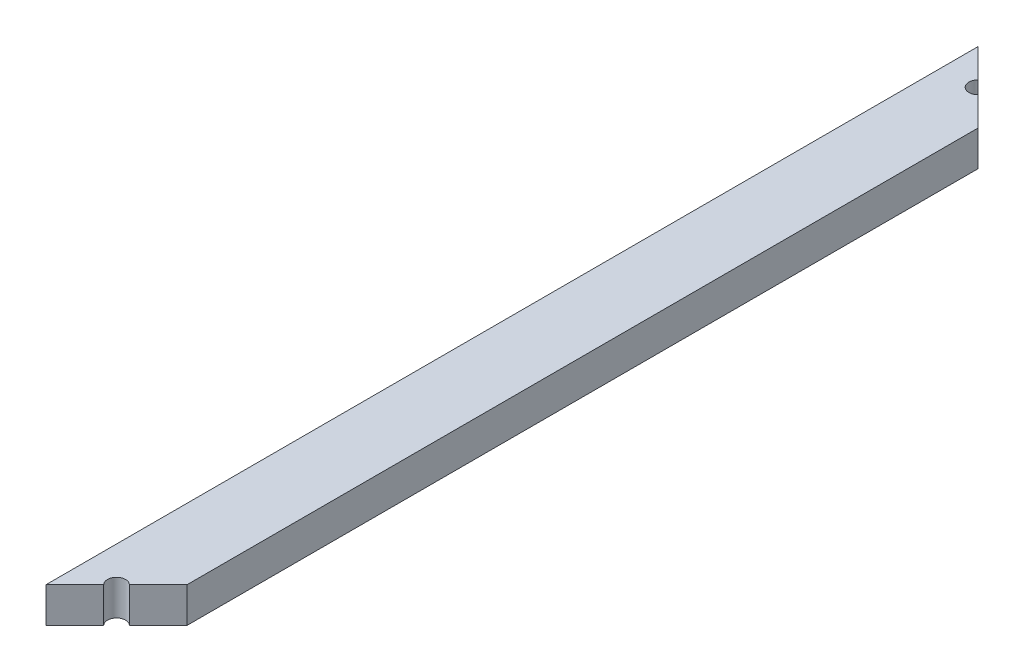
ISO-10303-21;
HEADER;
FILE_DESCRIPTION(('STEP AP214'),'2;1');
FILE_NAME('part.step','',(''),(''),'','','');
FILE_SCHEMA(('AUTOMOTIVE_DESIGN { 1 0 10303 214 1 1 1 1 }'));
ENDSEC;
DATA;
#1=APPLICATION_CONTEXT('core data for automotive mechanical design processes');
#2=APPLICATION_PROTOCOL_DEFINITION('international standard','automotive_design',2000,#1);
#3=PRODUCT_CONTEXT('',#1,'mechanical');
#4=PRODUCT('Part','Part','',(#3));
#5=PRODUCT_RELATED_PRODUCT_CATEGORY('part','',(#4));
#6=PRODUCT_DEFINITION_FORMATION('','',#4);
#7=PRODUCT_DEFINITION_CONTEXT('part definition',#1,'design');
#8=PRODUCT_DEFINITION('design','',#6,#7);
#9=PRODUCT_DEFINITION_SHAPE('','',#8);
#10=(LENGTH_UNIT() NAMED_UNIT(*) SI_UNIT(.MILLI.,.METRE.));
#11=(NAMED_UNIT(*) PLANE_ANGLE_UNIT() SI_UNIT($,.RADIAN.));
#12=(NAMED_UNIT(*) SI_UNIT($,.STERADIAN.) SOLID_ANGLE_UNIT());
#13=UNCERTAINTY_MEASURE_WITH_UNIT(LENGTH_MEASURE(1.E-05),#10,'distance_accuracy_value','');
#14=(GEOMETRIC_REPRESENTATION_CONTEXT(3) GLOBAL_UNCERTAINTY_ASSIGNED_CONTEXT((#13)) GLOBAL_UNIT_ASSIGNED_CONTEXT((#10,
#11,#12)) REPRESENTATION_CONTEXT('',''));
#15=CARTESIAN_POINT('',(0.,0.,0.));
#16=DIRECTION('',(0.,0.,1.));
#17=DIRECTION('',(1.,0.,0.));
#18=AXIS2_PLACEMENT_3D('',#15,#16,#17);
#19=CARTESIAN_POINT('',(0.,0.,185.));
#20=DIRECTION('',(-0.707106781186543,0.,-0.707106781186552));
#21=DIRECTION('',(-0.707106781186552,0.,0.707106781186543));
#22=AXIS2_PLACEMENT_3D('',#19,#20,#21);
#23=PLANE('',#22);
#24=DIRECTION('',(-0.707106781186552,0.,0.707106781186543));
#25=VECTOR('',#24,1.);
#26=CARTESIAN_POINT('',(0.,0.,185.));
#27=LINE('',#26,#25);
#28=CARTESIAN_POINT('',(5.7272077938642,0.,179.272792206136));
#29=VERTEX_POINT('',#28);
#30=CARTESIAN_POINT('',(0.,0.,185.));
#31=VERTEX_POINT('',#30);
#32=EDGE_CURVE('E108',#29,#31,#27,.T.);
#33=ORIENTED_EDGE('',*,*,#32,.F.);
#34=DIRECTION('',(0.,1.,0.));
#35=VECTOR('',#34,1.);
#36=CARTESIAN_POINT('',(5.7272077938642,0.,179.272792206136));
#37=LINE('',#36,#35);
#38=CARTESIAN_POINT('',(5.7272077938642,7.,179.272792206136));
#39=VERTEX_POINT('',#38);
#40=EDGE_CURVE('E96',#29,#39,#37,.T.);
#41=ORIENTED_EDGE('',*,*,#40,.T.);
#42=DIRECTION('',(-0.707106781186552,0.,0.707106781186543));
#43=VECTOR('',#42,1.);
#44=CARTESIAN_POINT('',(0.,7.,185.));
#45=LINE('',#44,#43);
#46=CARTESIAN_POINT('',(0.,7.,185.));
#47=VERTEX_POINT('',#46);
#48=EDGE_CURVE('E120',#39,#47,#45,.T.);
#49=ORIENTED_EDGE('',*,*,#48,.T.);
#50=DIRECTION('',(0.,-1.,0.));
#51=VECTOR('',#50,1.);
#52=CARTESIAN_POINT('',(0.,0.,185.));
#53=LINE('',#52,#51);
#54=EDGE_CURVE('E114',#47,#31,#53,.T.);
#55=ORIENTED_EDGE('',*,*,#54,.T.);
#56=EDGE_LOOP('',(#33,#41,#49,#55));
#57=FACE_BOUND('',#56,.T.);
#58=ADVANCED_FACE('F33',(#57),#23,.F.);
#59=CARTESIAN_POINT('',(0.,0.,0.));
#60=DIRECTION('',(-0.707106781186543,0.,0.707106781186552));
#61=DIRECTION('',(0.707106781186552,0.,0.707106781186543));
#62=AXIS2_PLACEMENT_3D('',#59,#60,#61);
#63=PLANE('',#62);
#64=DIRECTION('',(0.707106781186552,0.,0.707106781186543));
#65=VECTOR('',#64,1.);
#66=CARTESIAN_POINT('',(0.,0.,0.));
#67=LINE('',#66,#65);
#68=CARTESIAN_POINT('',(8.27279220613579,0.,8.27279220613569));
#69=VERTEX_POINT('',#68);
#70=CARTESIAN_POINT('',(14.,0.,13.9999999999998));
#71=VERTEX_POINT('',#70);
#72=EDGE_CURVE('E132',#69,#71,#67,.T.);
#73=ORIENTED_EDGE('',*,*,#72,.F.);
#74=DIRECTION('',(0.,1.,0.));
#75=VECTOR('',#74,1.);
#76=CARTESIAN_POINT('',(8.27279220613579,0.,8.27279220613569));
#77=LINE('',#76,#75);
#78=CARTESIAN_POINT('',(8.27279220613579,7.,8.27279220613569));
#79=VERTEX_POINT('',#78);
#80=EDGE_CURVE('E123',#69,#79,#77,.T.);
#81=ORIENTED_EDGE('',*,*,#80,.T.);
#82=DIRECTION('',(0.707106781186552,0.,0.707106781186543));
#83=VECTOR('',#82,1.);
#84=CARTESIAN_POINT('',(0.,7.,0.));
#85=LINE('',#84,#83);
#86=CARTESIAN_POINT('',(14.,7.,13.9999999999998));
#87=VERTEX_POINT('',#86);
#88=EDGE_CURVE('E127',#79,#87,#85,.T.);
#89=ORIENTED_EDGE('',*,*,#88,.T.);
#90=DIRECTION('',(0.,1.,0.));
#91=VECTOR('',#90,1.);
#92=CARTESIAN_POINT('',(14.,0.,13.9999999999998));
#93=LINE('',#92,#91);
#94=EDGE_CURVE('E131',#71,#87,#93,.T.);
#95=ORIENTED_EDGE('',*,*,#94,.F.);
#96=EDGE_LOOP('',(#73,#81,#89,#95));
#97=FACE_BOUND('',#96,.T.);
#98=ADVANCED_FACE('F155',(#97),#63,.F.);
#99=CARTESIAN_POINT('',(0.,0.,185.));
#100=DIRECTION('',(1.,0.,0.));
#101=DIRECTION('',(0.,0.,-1.));
#102=AXIS2_PLACEMENT_3D('',#99,#100,#101);
#103=PLANE('',#102);
#104=DIRECTION('',(0.,-1.,0.));
#105=VECTOR('',#104,1.);
#106=CARTESIAN_POINT('',(0.,0.,0.));
#107=LINE('',#106,#105);
#108=CARTESIAN_POINT('',(0.,7.,0.));
#109=VERTEX_POINT('',#108);
#110=CARTESIAN_POINT('',(0.,0.,0.));
#111=VERTEX_POINT('',#110);
#112=EDGE_CURVE('E138',#109,#111,#107,.T.);
#113=ORIENTED_EDGE('',*,*,#112,.T.);
#114=DIRECTION('',(0.,0.,-1.));
#115=VECTOR('',#114,1.);
#116=CARTESIAN_POINT('',(0.,0.,185.));
#117=LINE('',#116,#115);
#118=EDGE_CURVE('E11',#31,#111,#117,.T.);
#119=ORIENTED_EDGE('',*,*,#118,.F.);
#120=ORIENTED_EDGE('',*,*,#54,.F.);
#121=DIRECTION('',(0.,0.,-1.));
#122=VECTOR('',#121,1.);
#123=CARTESIAN_POINT('',(0.,7.,185.));
#124=LINE('',#123,#122);
#125=EDGE_CURVE('E140',#47,#109,#124,.T.);
#126=ORIENTED_EDGE('',*,*,#125,.T.);
#127=EDGE_LOOP('',(#113,#119,#120,#126));
#128=FACE_BOUND('',#127,.T.);
#129=ADVANCED_FACE('F35',(#128),#103,.F.);
#130=CARTESIAN_POINT('',(0.,0.,185.));
#131=DIRECTION('',(0.,1.,0.));
#132=DIRECTION('',(0.,0.,1.));
#133=AXIS2_PLACEMENT_3D('',#130,#131,#132);
#134=PLANE('',#133);
#135=CARTESIAN_POINT('',(14.,0.,171.));
#136=VERTEX_POINT('',#135);
#137=CARTESIAN_POINT('',(8.2727922061358,0.,176.727207793864));
#138=VERTEX_POINT('',#137);
#139=EDGE_CURVE('E111',#136,#138,#27,.T.);
#140=ORIENTED_EDGE('',*,*,#139,.T.);
#141=CARTESIAN_POINT('',(7.,0.,178.));
#142=DIRECTION('',(0.,1.,0.));
#143=DIRECTION('',(0.,0.,-1.));
#144=AXIS2_PLACEMENT_3D('',#141,#142,#143);
#145=CIRCLE('',#144,1.8);
#146=EDGE_CURVE('E48',#138,#29,#145,.T.);
#147=ORIENTED_EDGE('',*,*,#146,.T.);
#148=ORIENTED_EDGE('',*,*,#32,.T.);
#149=ORIENTED_EDGE('',*,*,#118,.T.);
#150=CARTESIAN_POINT('',(5.72720779386421,0.,5.72720779386413));
#151=VERTEX_POINT('',#150);
#152=EDGE_CURVE('E128',#111,#151,#67,.T.);
#153=ORIENTED_EDGE('',*,*,#152,.T.);
#154=CARTESIAN_POINT('',(7.,0.,6.99999999999991));
#155=DIRECTION('',(0.,1.,0.));
#156=DIRECTION('',(0.,0.,1.));
#157=AXIS2_PLACEMENT_3D('',#154,#155,#156);
#158=CIRCLE('',#157,1.8);
#159=EDGE_CURVE('E56',#151,#69,#158,.T.);
#160=ORIENTED_EDGE('',*,*,#159,.T.);
#161=ORIENTED_EDGE('',*,*,#72,.T.);
#162=DIRECTION('',(0.,0.,-1.));
#163=VECTOR('',#162,1.);
#164=CARTESIAN_POINT('',(14.,0.,185.));
#165=LINE('',#164,#163);
#166=EDGE_CURVE('E41',#136,#71,#165,.T.);
#167=ORIENTED_EDGE('',*,*,#166,.F.);
#168=EDGE_LOOP('',(#140,#147,#148,#149,#153,#160,#161,#167));
#169=FACE_BOUND('',#168,.T.);
#170=ADVANCED_FACE('F107',(#169),#134,.F.);
#171=CARTESIAN_POINT('',(14.,0.,185.));
#172=DIRECTION('',(-1.,0.,0.));
#173=DIRECTION('',(0.,0.,1.));
#174=AXIS2_PLACEMENT_3D('',#171,#172,#173);
#175=PLANE('',#174);
#176=DIRECTION('',(0.,0.,-1.));
#177=VECTOR('',#176,1.);
#178=CARTESIAN_POINT('',(14.,7.,185.));
#179=LINE('',#178,#177);
#180=CARTESIAN_POINT('',(14.,7.,171.));
#181=VERTEX_POINT('',#180);
#182=EDGE_CURVE('E145',#181,#87,#179,.T.);
#183=ORIENTED_EDGE('',*,*,#182,.F.);
#184=DIRECTION('',(0.,1.,0.));
#185=VECTOR('',#184,1.);
#186=CARTESIAN_POINT('',(14.,0.,171.));
#187=LINE('',#186,#185);
#188=EDGE_CURVE('E118',#136,#181,#187,.T.);
#189=ORIENTED_EDGE('',*,*,#188,.F.);
#190=ORIENTED_EDGE('',*,*,#166,.T.);
#191=ORIENTED_EDGE('',*,*,#94,.T.);
#192=EDGE_LOOP('',(#183,#189,#190,#191));
#193=FACE_BOUND('',#192,.T.);
#194=ADVANCED_FACE('F152',(#193),#175,.F.);
#195=CARTESIAN_POINT('',(0.,7.,185.));
#196=DIRECTION('',(0.,-1.,0.));
#197=DIRECTION('',(0.,0.,-1.));
#198=AXIS2_PLACEMENT_3D('',#195,#196,#197);
#199=PLANE('',#198);
#200=ORIENTED_EDGE('',*,*,#48,.F.);
#201=CARTESIAN_POINT('',(7.,7.,178.));
#202=DIRECTION('',(0.,1.,0.));
#203=DIRECTION('',(0.,0.,-1.));
#204=AXIS2_PLACEMENT_3D('',#201,#202,#203);
#205=CIRCLE('',#204,1.8);
#206=CARTESIAN_POINT('',(8.2727922061358,7.,176.727207793864));
#207=VERTEX_POINT('',#206);
#208=EDGE_CURVE('E99',#207,#39,#205,.T.);
#209=ORIENTED_EDGE('',*,*,#208,.F.);
#210=EDGE_CURVE('E116',#181,#207,#45,.T.);
#211=ORIENTED_EDGE('',*,*,#210,.F.);
#212=ORIENTED_EDGE('',*,*,#182,.T.);
#213=ORIENTED_EDGE('',*,*,#88,.F.);
#214=CARTESIAN_POINT('',(7.,7.,6.99999999999991));
#215=DIRECTION('',(0.,1.,0.));
#216=DIRECTION('',(0.,0.,1.));
#217=AXIS2_PLACEMENT_3D('',#214,#215,#216);
#218=CIRCLE('',#217,1.8);
#219=CARTESIAN_POINT('',(5.72720779386421,7.,5.72720779386413));
#220=VERTEX_POINT('',#219);
#221=EDGE_CURVE('E164',#220,#79,#218,.T.);
#222=ORIENTED_EDGE('',*,*,#221,.F.);
#223=EDGE_CURVE('E133',#109,#220,#85,.T.);
#224=ORIENTED_EDGE('',*,*,#223,.F.);
#225=ORIENTED_EDGE('',*,*,#125,.F.);
#226=EDGE_LOOP('',(#200,#209,#211,#212,#213,#222,#224,#225));
#227=FACE_BOUND('',#226,.T.);
#228=ADVANCED_FACE('F161',(#227),#199,.F.);
#229=ORIENTED_EDGE('',*,*,#223,.T.);
#230=DIRECTION('',(0.,1.,0.));
#231=VECTOR('',#230,1.);
#232=CARTESIAN_POINT('',(5.72720779386421,0.,5.72720779386413));
#233=LINE('',#232,#231);
#234=EDGE_CURVE('E169',#151,#220,#233,.T.);
#235=ORIENTED_EDGE('',*,*,#234,.F.);
#236=ORIENTED_EDGE('',*,*,#152,.F.);
#237=ORIENTED_EDGE('',*,*,#112,.F.);
#238=EDGE_LOOP('',(#229,#235,#236,#237));
#239=FACE_BOUND('',#238,.T.);
#240=ADVANCED_FACE('F174',(#239),#63,.F.);
#241=ORIENTED_EDGE('',*,*,#210,.T.);
#242=DIRECTION('',(0.,1.,0.));
#243=VECTOR('',#242,1.);
#244=CARTESIAN_POINT('',(8.2727922061358,0.,176.727207793864));
#245=LINE('',#244,#243);
#246=EDGE_CURVE('E103',#138,#207,#245,.T.);
#247=ORIENTED_EDGE('',*,*,#246,.F.);
#248=ORIENTED_EDGE('',*,*,#139,.F.);
#249=ORIENTED_EDGE('',*,*,#188,.T.);
#250=EDGE_LOOP('',(#241,#247,#248,#249));
#251=FACE_BOUND('',#250,.T.);
#252=ADVANCED_FACE('F163',(#251),#23,.F.);
#253=CARTESIAN_POINT('',(7.,0.,6.99999999999991));
#254=DIRECTION('',(0.,1.,0.));
#255=DIRECTION('',(0.,0.,1.));
#256=AXIS2_PLACEMENT_3D('',#253,#254,#255);
#257=CYLINDRICAL_SURFACE('',#256,1.8);
#258=ORIENTED_EDGE('',*,*,#221,.T.);
#259=ORIENTED_EDGE('',*,*,#80,.F.);
#260=ORIENTED_EDGE('',*,*,#159,.F.);
#261=ORIENTED_EDGE('',*,*,#234,.T.);
#262=EDGE_LOOP('',(#258,#259,#260,#261));
#263=FACE_BOUND('',#262,.T.);
#264=ADVANCED_FACE('F181',(#263),#257,.F.);
#265=CARTESIAN_POINT('',(7.,0.,178.));
#266=DIRECTION('',(0.,1.,0.));
#267=DIRECTION('',(0.,0.,1.));
#268=AXIS2_PLACEMENT_3D('',#265,#266,#267);
#269=CYLINDRICAL_SURFACE('',#268,1.8);
#270=ORIENTED_EDGE('',*,*,#208,.T.);
#271=ORIENTED_EDGE('',*,*,#40,.F.);
#272=ORIENTED_EDGE('',*,*,#146,.F.);
#273=ORIENTED_EDGE('',*,*,#246,.T.);
#274=EDGE_LOOP('',(#270,#271,#272,#273));
#275=FACE_BOUND('',#274,.T.);
#276=ADVANCED_FACE('F97',(#275),#269,.F.);
#277=CLOSED_SHELL('',(#58,#98,#129,#170,#194,#228,#240,#252,#264,#276));
#278=MANIFOLD_SOLID_BREP('B2',#277);
#279=ADVANCED_BREP_SHAPE_REPRESENTATION('',(#18,#278),#14);
#280=SHAPE_DEFINITION_REPRESENTATION(#9,#279);
ENDSEC;
END-ISO-10303-21;
